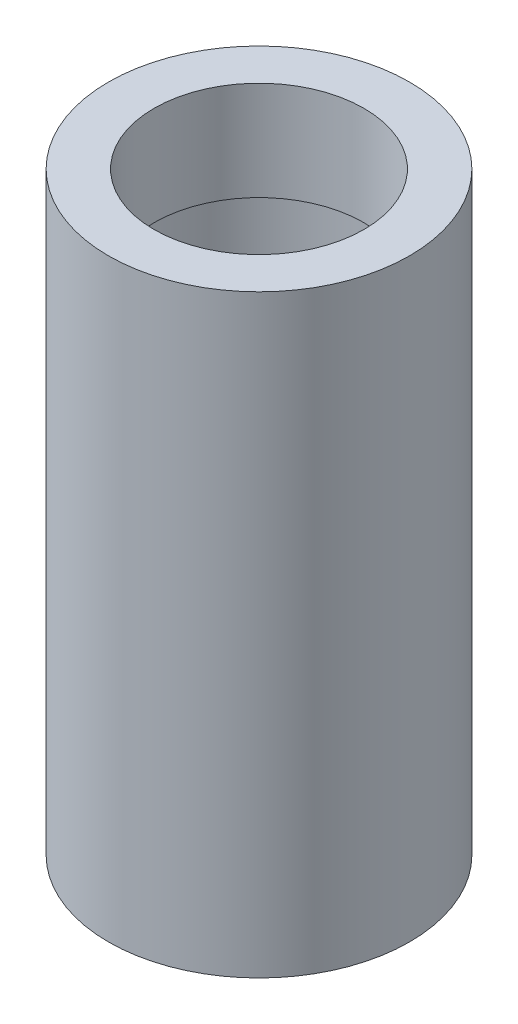
ISO-10303-21;
HEADER;
FILE_DESCRIPTION(('STEP AP214'),'2;1');
FILE_NAME('part.step','',(''),(''),'','','');
FILE_SCHEMA(('AUTOMOTIVE_DESIGN { 1 0 10303 214 1 1 1 1 }'));
ENDSEC;
DATA;
#1=APPLICATION_CONTEXT('core data for automotive mechanical design processes');
#2=APPLICATION_PROTOCOL_DEFINITION('international standard','automotive_design',2000,#1);
#3=PRODUCT_CONTEXT('',#1,'mechanical');
#4=PRODUCT('Part','Part','',(#3));
#5=PRODUCT_RELATED_PRODUCT_CATEGORY('part','',(#4));
#6=PRODUCT_DEFINITION_FORMATION('','',#4);
#7=PRODUCT_DEFINITION_CONTEXT('part definition',#1,'design');
#8=PRODUCT_DEFINITION('design','',#6,#7);
#9=PRODUCT_DEFINITION_SHAPE('','',#8);
#10=(LENGTH_UNIT() NAMED_UNIT(*) SI_UNIT(.MILLI.,.METRE.));
#11=(NAMED_UNIT(*) PLANE_ANGLE_UNIT() SI_UNIT($,.RADIAN.));
#12=(NAMED_UNIT(*) SI_UNIT($,.STERADIAN.) SOLID_ANGLE_UNIT());
#13=UNCERTAINTY_MEASURE_WITH_UNIT(LENGTH_MEASURE(1.E-05),#10,'distance_accuracy_value','');
#14=(GEOMETRIC_REPRESENTATION_CONTEXT(3) GLOBAL_UNCERTAINTY_ASSIGNED_CONTEXT((#13)) GLOBAL_UNIT_ASSIGNED_CONTEXT((#10,
#11,#12)) REPRESENTATION_CONTEXT('',''));
#15=CARTESIAN_POINT('',(0.,0.,0.));
#16=DIRECTION('',(0.,0.,1.));
#17=DIRECTION('',(1.,0.,0.));
#18=AXIS2_PLACEMENT_3D('',#15,#16,#17);
#19=CARTESIAN_POINT('',(0.,15.,0.));
#20=DIRECTION('',(0.,-1.,0.));
#21=DIRECTION('',(0.,0.,-1.));
#22=AXIS2_PLACEMENT_3D('',#19,#20,#21);
#23=CYLINDRICAL_SURFACE('',#22,3.);
#24=CARTESIAN_POINT('',(0.,0.3,0.));
#25=DIRECTION('',(0.,1.,0.));
#26=DIRECTION('',(0.,0.,1.));
#27=AXIS2_PLACEMENT_3D('',#24,#25,#26);
#28=CIRCLE('',#27,3.);
#29=CARTESIAN_POINT('',(0.,0.3,3.));
#30=VERTEX_POINT('',#29);
#31=EDGE_CURVE('E10',#30,#30,#28,.F.);
#32=ORIENTED_EDGE('',*,*,#31,.T.);
#33=EDGE_LOOP('',(#32));
#34=FACE_BOUND('',#33,.T.);
#35=CARTESIAN_POINT('',(0.,12.5,0.));
#36=DIRECTION('',(0.,1.,0.));
#37=DIRECTION('',(0.,0.,1.));
#38=AXIS2_PLACEMENT_3D('',#35,#36,#37);
#39=CIRCLE('',#38,3.);
#40=CARTESIAN_POINT('',(0.,12.5,3.));
#41=VERTEX_POINT('',#40);
#42=EDGE_CURVE('E54',#41,#41,#39,.T.);
#43=ORIENTED_EDGE('',*,*,#42,.T.);
#44=EDGE_LOOP('',(#43));
#45=FACE_BOUND('',#44,.T.);
#46=ADVANCED_FACE('F40',(#34,#45),#23,.F.);
#47=CARTESIAN_POINT('',(0.,15.,0.));
#48=DIRECTION('',(0.,1.,0.));
#49=DIRECTION('',(0.,0.,1.));
#50=AXIS2_PLACEMENT_3D('',#47,#48,#49);
#51=PLANE('',#50);
#52=CARTESIAN_POINT('',(0.,15.,0.));
#53=DIRECTION('',(0.,1.,0.));
#54=DIRECTION('',(0.,0.,1.));
#55=AXIS2_PLACEMENT_3D('',#52,#53,#54);
#56=CIRCLE('',#55,3.8);
#57=CARTESIAN_POINT('',(0.,15.,3.8));
#58=VERTEX_POINT('',#57);
#59=EDGE_CURVE('E48',#58,#58,#56,.T.);
#60=ORIENTED_EDGE('',*,*,#59,.T.);
#61=EDGE_LOOP('',(#60));
#62=FACE_BOUND('',#61,.T.);
#63=CARTESIAN_POINT('',(0.,15.,0.));
#64=DIRECTION('',(0.,1.,0.));
#65=DIRECTION('',(0.,0.,1.));
#66=AXIS2_PLACEMENT_3D('',#63,#64,#65);
#67=CIRCLE('',#66,2.65);
#68=CARTESIAN_POINT('',(0.,15.,2.65));
#69=VERTEX_POINT('',#68);
#70=EDGE_CURVE('E61',#69,#69,#67,.T.);
#71=ORIENTED_EDGE('',*,*,#70,.F.);
#72=EDGE_LOOP('',(#71));
#73=FACE_BOUND('',#72,.T.);
#74=ADVANCED_FACE('F76',(#62,#73),#51,.T.);
#75=CARTESIAN_POINT('',(0.,0.,0.));
#76=DIRECTION('',(0.,1.,0.));
#77=DIRECTION('',(0.,0.,1.));
#78=AXIS2_PLACEMENT_3D('',#75,#76,#77);
#79=PLANE('',#78);
#80=CARTESIAN_POINT('',(0.,0.,0.));
#81=DIRECTION('',(0.,1.,0.));
#82=DIRECTION('',(0.,0.,1.));
#83=AXIS2_PLACEMENT_3D('',#80,#81,#82);
#84=CIRCLE('',#83,3.3);
#85=CARTESIAN_POINT('',(0.,0.,3.3));
#86=VERTEX_POINT('',#85);
#87=EDGE_CURVE('E42',#86,#86,#84,.T.);
#88=ORIENTED_EDGE('',*,*,#87,.T.);
#89=EDGE_LOOP('',(#88));
#90=FACE_BOUND('',#89,.T.);
#91=CARTESIAN_POINT('',(0.,0.,0.));
#92=DIRECTION('',(0.,1.,0.));
#93=DIRECTION('',(0.,0.,1.));
#94=AXIS2_PLACEMENT_3D('',#91,#92,#93);
#95=CIRCLE('',#94,3.8);
#96=CARTESIAN_POINT('',(0.,0.,3.8));
#97=VERTEX_POINT('',#96);
#98=EDGE_CURVE('E55',#97,#97,#95,.T.);
#99=ORIENTED_EDGE('',*,*,#98,.F.);
#100=EDGE_LOOP('',(#99));
#101=FACE_BOUND('',#100,.T.);
#102=ADVANCED_FACE('F77',(#90,#101),#79,.F.);
#103=CARTESIAN_POINT('',(0.,15.,0.));
#104=DIRECTION('',(0.,-1.,0.));
#105=DIRECTION('',(0.,0.,-1.));
#106=AXIS2_PLACEMENT_3D('',#103,#104,#105);
#107=CYLINDRICAL_SURFACE('',#106,3.8);
#108=ORIENTED_EDGE('',*,*,#59,.F.);
#109=EDGE_LOOP('',(#108));
#110=FACE_BOUND('',#109,.T.);
#111=ORIENTED_EDGE('',*,*,#98,.T.);
#112=EDGE_LOOP('',(#111));
#113=FACE_BOUND('',#112,.T.);
#114=ADVANCED_FACE('F88',(#110,#113),#107,.T.);
#115=CARTESIAN_POINT('',(0.,12.5,0.));
#116=DIRECTION('',(0.,1.,0.));
#117=DIRECTION('',(0.,0.,1.));
#118=AXIS2_PLACEMENT_3D('',#115,#116,#117);
#119=PLANE('',#118);
#120=CARTESIAN_POINT('',(0.,12.5,0.));
#121=DIRECTION('',(0.,1.,0.));
#122=DIRECTION('',(0.,0.,1.));
#123=AXIS2_PLACEMENT_3D('',#120,#121,#122);
#124=CIRCLE('',#123,2.65);
#125=CARTESIAN_POINT('',(0.,12.5,2.65));
#126=VERTEX_POINT('',#125);
#127=EDGE_CURVE('E59',#126,#126,#124,.T.);
#128=ORIENTED_EDGE('',*,*,#127,.T.);
#129=EDGE_LOOP('',(#128));
#130=FACE_BOUND('',#129,.T.);
#131=ORIENTED_EDGE('',*,*,#42,.F.);
#132=EDGE_LOOP('',(#131));
#133=FACE_BOUND('',#132,.T.);
#134=ADVANCED_FACE('F66',(#130,#133),#119,.F.);
#135=CARTESIAN_POINT('',(0.,12.5,0.));
#136=DIRECTION('',(0.,1.,0.));
#137=DIRECTION('',(0.,0.,1.));
#138=AXIS2_PLACEMENT_3D('',#135,#136,#137);
#139=CYLINDRICAL_SURFACE('',#138,2.65);
#140=ORIENTED_EDGE('',*,*,#127,.F.);
#141=EDGE_LOOP('',(#140));
#142=FACE_BOUND('',#141,.T.);
#143=ORIENTED_EDGE('',*,*,#70,.T.);
#144=EDGE_LOOP('',(#143));
#145=FACE_BOUND('',#144,.T.);
#146=ADVANCED_FACE('F67',(#142,#145),#139,.F.);
#147=CARTESIAN_POINT('',(0.,0.3,0.));
#148=DIRECTION('',(0.,1.,0.));
#149=DIRECTION('',(0.,0.,1.));
#150=AXIS2_PLACEMENT_3D('',#147,#148,#149);
#151=TOROIDAL_SURFACE('',#150,3.3,0.3);
#152=ORIENTED_EDGE('',*,*,#31,.F.);
#153=EDGE_LOOP('',(#152));
#154=FACE_BOUND('',#153,.T.);
#155=ORIENTED_EDGE('',*,*,#87,.F.);
#156=EDGE_LOOP('',(#155));
#157=FACE_BOUND('',#156,.T.);
#158=ADVANCED_FACE('F39',(#154,#157),#151,.T.);
#159=CLOSED_SHELL('',(#46,#74,#102,#114,#134,#146,#158));
#160=MANIFOLD_SOLID_BREP('B2',#159);
#161=ADVANCED_BREP_SHAPE_REPRESENTATION('',(#18,#160),#14);
#162=SHAPE_DEFINITION_REPRESENTATION(#9,#161);
ENDSEC;
END-ISO-10303-21;
